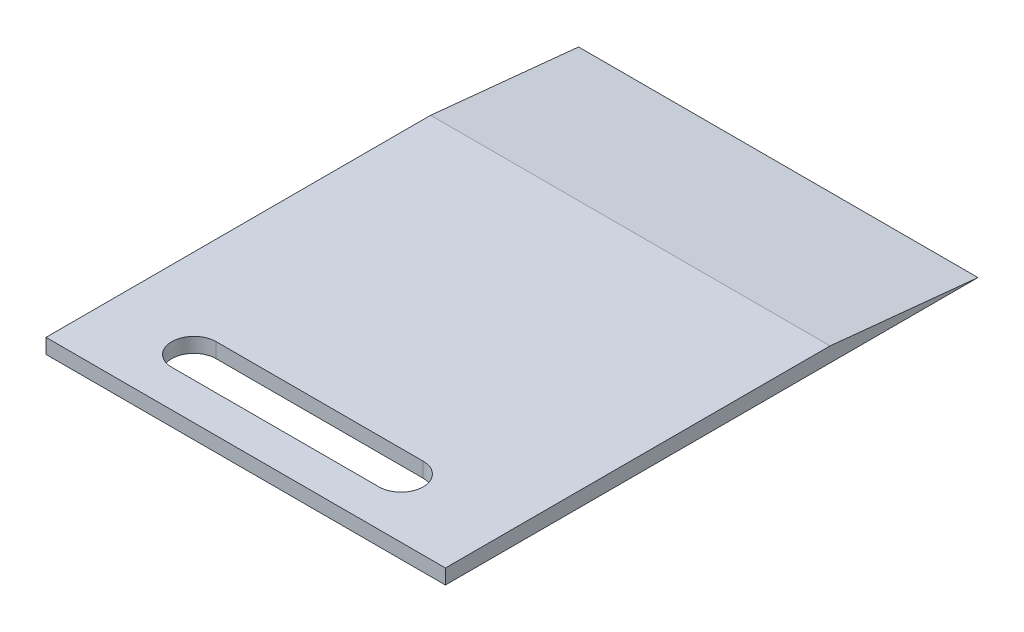
ISO-10303-21;
HEADER;
FILE_DESCRIPTION(('STEP AP214'),'2;1');
FILE_NAME('part.step','',(''),(''),'','','');
FILE_SCHEMA(('AUTOMOTIVE_DESIGN { 1 0 10303 214 1 1 1 1 }'));
ENDSEC;
DATA;
#1=APPLICATION_CONTEXT('core data for automotive mechanical design processes');
#2=APPLICATION_PROTOCOL_DEFINITION('international standard','automotive_design',2000,#1);
#3=PRODUCT_CONTEXT('',#1,'mechanical');
#4=PRODUCT('Part','Part','',(#3));
#5=PRODUCT_RELATED_PRODUCT_CATEGORY('part','',(#4));
#6=PRODUCT_DEFINITION_FORMATION('','',#4);
#7=PRODUCT_DEFINITION_CONTEXT('part definition',#1,'design');
#8=PRODUCT_DEFINITION('design','',#6,#7);
#9=PRODUCT_DEFINITION_SHAPE('','',#8);
#10=(LENGTH_UNIT() NAMED_UNIT(*) SI_UNIT(.MILLI.,.METRE.));
#11=(NAMED_UNIT(*) PLANE_ANGLE_UNIT() SI_UNIT($,.RADIAN.));
#12=(NAMED_UNIT(*) SI_UNIT($,.STERADIAN.) SOLID_ANGLE_UNIT());
#13=UNCERTAINTY_MEASURE_WITH_UNIT(LENGTH_MEASURE(1.E-05),#10,'distance_accuracy_value','');
#14=(GEOMETRIC_REPRESENTATION_CONTEXT(3) GLOBAL_UNCERTAINTY_ASSIGNED_CONTEXT((#13)) GLOBAL_UNIT_ASSIGNED_CONTEXT((#10,
#11,#12)) REPRESENTATION_CONTEXT('',''));
#15=CARTESIAN_POINT('',(0.,0.,0.));
#16=DIRECTION('',(0.,0.,1.));
#17=DIRECTION('',(1.,0.,0.));
#18=AXIS2_PLACEMENT_3D('',#15,#16,#17);
#19=CARTESIAN_POINT('',(13.5,0.5,0.));
#20=DIRECTION('',(0.,0.,-1.));
#21=DIRECTION('',(0.,1.,0.));
#22=AXIS2_PLACEMENT_3D('',#19,#20,#21);
#23=PLANE('',#22);
#24=DIRECTION('',(0.,-1.,0.));
#25=VECTOR('',#24,1.);
#26=CARTESIAN_POINT('',(0.,0.5,0.));
#27=LINE('',#26,#25);
#28=CARTESIAN_POINT('',(0.,0.5,0.));
#29=VERTEX_POINT('',#28);
#30=CARTESIAN_POINT('',(0.,0.,0.));
#31=VERTEX_POINT('',#30);
#32=EDGE_CURVE('E147',#29,#31,#27,.T.);
#33=ORIENTED_EDGE('',*,*,#32,.T.);
#34=DIRECTION('',(-1.,0.,0.));
#35=VECTOR('',#34,1.);
#36=CARTESIAN_POINT('',(13.5,0.,0.));
#37=LINE('',#36,#35);
#38=CARTESIAN_POINT('',(13.5,0.,0.));
#39=VERTEX_POINT('',#38);
#40=EDGE_CURVE('E11',#39,#31,#37,.T.);
#41=ORIENTED_EDGE('',*,*,#40,.F.);
#42=DIRECTION('',(0.,-1.,0.));
#43=VECTOR('',#42,1.);
#44=CARTESIAN_POINT('',(13.5,0.5,0.));
#45=LINE('',#44,#43);
#46=CARTESIAN_POINT('',(13.5,0.5,0.));
#47=VERTEX_POINT('',#46);
#48=EDGE_CURVE('E153',#47,#39,#45,.T.);
#49=ORIENTED_EDGE('',*,*,#48,.F.);
#50=DIRECTION('',(-1.,0.,0.));
#51=VECTOR('',#50,1.);
#52=CARTESIAN_POINT('',(13.5,0.5,0.));
#53=LINE('',#52,#51);
#54=EDGE_CURVE('E167',#47,#29,#53,.T.);
#55=ORIENTED_EDGE('',*,*,#54,.T.);
#56=EDGE_LOOP('',(#33,#41,#49,#55));
#57=FACE_BOUND('',#56,.T.);
#58=ADVANCED_FACE('F39',(#57),#23,.F.);
#59=CARTESIAN_POINT('',(13.5,0.,0.));
#60=DIRECTION('',(0.,1.,0.));
#61=DIRECTION('',(0.,0.,1.));
#62=AXIS2_PLACEMENT_3D('',#59,#60,#61);
#63=PLANE('',#62);
#64=DIRECTION('',(1.,0.,0.));
#65=VECTOR('',#64,1.);
#66=CARTESIAN_POINT('',(3.,0.,-2.75));
#67=LINE('',#66,#65);
#68=CARTESIAN_POINT('',(3.,0.,-2.75));
#69=VERTEX_POINT('',#68);
#70=CARTESIAN_POINT('',(10.,0.,-2.75));
#71=VERTEX_POINT('',#70);
#72=EDGE_CURVE('E114',#69,#71,#67,.T.);
#73=ORIENTED_EDGE('',*,*,#72,.F.);
#74=CARTESIAN_POINT('',(3.,0.,-2.));
#75=DIRECTION('',(0.,1.,0.));
#76=DIRECTION('',(0.,0.,1.));
#77=AXIS2_PLACEMENT_3D('',#74,#75,#76);
#78=CIRCLE('',#77,0.75);
#79=CARTESIAN_POINT('',(3.,0.,-1.25));
#80=VERTEX_POINT('',#79);
#81=EDGE_CURVE('E107',#69,#80,#78,.T.);
#82=ORIENTED_EDGE('',*,*,#81,.T.);
#83=DIRECTION('',(1.,0.,0.));
#84=VECTOR('',#83,1.);
#85=CARTESIAN_POINT('',(3.,0.,-1.25));
#86=LINE('',#85,#84);
#87=CARTESIAN_POINT('',(10.,0.,-1.25));
#88=VERTEX_POINT('',#87);
#89=EDGE_CURVE('E117',#80,#88,#86,.T.);
#90=ORIENTED_EDGE('',*,*,#89,.T.);
#91=CARTESIAN_POINT('',(10.,0.,-2.));
#92=DIRECTION('',(0.,1.,0.));
#93=DIRECTION('',(0.,0.,1.));
#94=AXIS2_PLACEMENT_3D('',#91,#92,#93);
#95=CIRCLE('',#94,0.75);
#96=EDGE_CURVE('E54',#88,#71,#95,.T.);
#97=ORIENTED_EDGE('',*,*,#96,.T.);
#98=EDGE_LOOP('',(#73,#82,#90,#97));
#99=FACE_BOUND('',#98,.T.);
#100=DIRECTION('',(0.,0.,-1.));
#101=VECTOR('',#100,1.);
#102=CARTESIAN_POINT('',(0.,0.,0.));
#103=LINE('',#102,#101);
#104=CARTESIAN_POINT('',(0.,0.,-18.));
#105=VERTEX_POINT('',#104);
#106=EDGE_CURVE('E171',#31,#105,#103,.T.);
#107=ORIENTED_EDGE('',*,*,#106,.T.);
#108=DIRECTION('',(-1.,0.,0.));
#109=VECTOR('',#108,1.);
#110=CARTESIAN_POINT('',(13.5,0.,-18.));
#111=LINE('',#110,#109);
#112=CARTESIAN_POINT('',(13.5,0.,-18.));
#113=VERTEX_POINT('',#112);
#114=EDGE_CURVE('E47',#113,#105,#111,.T.);
#115=ORIENTED_EDGE('',*,*,#114,.F.);
#116=DIRECTION('',(0.,0.,-1.));
#117=VECTOR('',#116,1.);
#118=CARTESIAN_POINT('',(13.5,0.,0.));
#119=LINE('',#118,#117);
#120=EDGE_CURVE('E157',#39,#113,#119,.T.);
#121=ORIENTED_EDGE('',*,*,#120,.F.);
#122=ORIENTED_EDGE('',*,*,#40,.T.);
#123=EDGE_LOOP('',(#107,#115,#121,#122));
#124=FACE_BOUND('',#123,.T.);
#125=ADVANCED_FACE('F122',(#99,#124),#63,.F.);
#126=CARTESIAN_POINT('',(13.5,0.,-18.));
#127=DIRECTION('',(0.,-0.995037190209989,0.0995037190209992));
#128=DIRECTION('',(0.,-0.0995037190209992,-0.995037190209989));
#129=AXIS2_PLACEMENT_3D('',#126,#127,#128);
#130=PLANE('',#129);
#131=DIRECTION('',(0.,0.0995037190209992,0.995037190209989));
#132=VECTOR('',#131,1.);
#133=CARTESIAN_POINT('',(0.,0.,-18.));
#134=LINE('',#133,#132);
#135=CARTESIAN_POINT('',(0.,0.500000000000001,-13.));
#136=VERTEX_POINT('',#135);
#137=EDGE_CURVE('E174',#105,#136,#134,.T.);
#138=ORIENTED_EDGE('',*,*,#137,.T.);
#139=DIRECTION('',(-1.,0.,0.));
#140=VECTOR('',#139,1.);
#141=CARTESIAN_POINT('',(13.5,0.500000000000001,-13.));
#142=LINE('',#141,#140);
#143=CARTESIAN_POINT('',(13.5,0.500000000000001,-13.));
#144=VERTEX_POINT('',#143);
#145=EDGE_CURVE('E182',#144,#136,#142,.T.);
#146=ORIENTED_EDGE('',*,*,#145,.F.);
#147=DIRECTION('',(0.,0.0995037190209992,0.995037190209989));
#148=VECTOR('',#147,1.);
#149=CARTESIAN_POINT('',(13.5,0.,-18.));
#150=LINE('',#149,#148);
#151=EDGE_CURVE('E161',#113,#144,#150,.T.);
#152=ORIENTED_EDGE('',*,*,#151,.F.);
#153=ORIENTED_EDGE('',*,*,#114,.T.);
#154=EDGE_LOOP('',(#138,#146,#152,#153));
#155=FACE_BOUND('',#154,.T.);
#156=ADVANCED_FACE('F191',(#155),#130,.F.);
#157=CARTESIAN_POINT('',(13.5,0.500000000000001,-13.));
#158=DIRECTION('',(0.,-1.,0.));
#159=DIRECTION('',(0.,0.,-1.));
#160=AXIS2_PLACEMENT_3D('',#157,#158,#159);
#161=PLANE('',#160);
#162=DIRECTION('',(1.,0.,0.));
#163=VECTOR('',#162,1.);
#164=CARTESIAN_POINT('',(3.,0.5,-1.25));
#165=LINE('',#164,#163);
#166=CARTESIAN_POINT('',(3.,0.5,-1.25));
#167=VERTEX_POINT('',#166);
#168=CARTESIAN_POINT('',(10.,0.5,-1.25));
#169=VERTEX_POINT('',#168);
#170=EDGE_CURVE('E138',#167,#169,#165,.T.);
#171=ORIENTED_EDGE('',*,*,#170,.F.);
#172=CARTESIAN_POINT('',(3.,0.5,-2.));
#173=DIRECTION('',(0.,1.,0.));
#174=DIRECTION('',(0.,0.,1.));
#175=AXIS2_PLACEMENT_3D('',#172,#173,#174);
#176=CIRCLE('',#175,0.75);
#177=CARTESIAN_POINT('',(3.,0.5,-2.75));
#178=VERTEX_POINT('',#177);
#179=EDGE_CURVE('E62',#178,#167,#176,.T.);
#180=ORIENTED_EDGE('',*,*,#179,.F.);
#181=DIRECTION('',(1.,0.,0.));
#182=VECTOR('',#181,1.);
#183=CARTESIAN_POINT('',(3.,0.5,-2.75));
#184=LINE('',#183,#182);
#185=CARTESIAN_POINT('',(10.,0.5,-2.75));
#186=VERTEX_POINT('',#185);
#187=EDGE_CURVE('E125',#178,#186,#184,.T.);
#188=ORIENTED_EDGE('',*,*,#187,.T.);
#189=CARTESIAN_POINT('',(10.,0.5,-2.));
#190=DIRECTION('',(0.,1.,0.));
#191=DIRECTION('',(0.,0.,1.));
#192=AXIS2_PLACEMENT_3D('',#189,#190,#191);
#193=CIRCLE('',#192,0.75);
#194=EDGE_CURVE('E129',#169,#186,#193,.T.);
#195=ORIENTED_EDGE('',*,*,#194,.F.);
#196=EDGE_LOOP('',(#171,#180,#188,#195));
#197=FACE_BOUND('',#196,.T.);
#198=DIRECTION('',(0.,0.,1.));
#199=VECTOR('',#198,1.);
#200=CARTESIAN_POINT('',(0.,0.500000000000001,-13.));
#201=LINE('',#200,#199);
#202=EDGE_CURVE('E158',#136,#29,#201,.T.);
#203=ORIENTED_EDGE('',*,*,#202,.T.);
#204=ORIENTED_EDGE('',*,*,#54,.F.);
#205=DIRECTION('',(0.,0.,1.));
#206=VECTOR('',#205,1.);
#207=CARTESIAN_POINT('',(13.5,0.500000000000001,-13.));
#208=LINE('',#207,#206);
#209=EDGE_CURVE('E164',#144,#47,#208,.T.);
#210=ORIENTED_EDGE('',*,*,#209,.F.);
#211=ORIENTED_EDGE('',*,*,#145,.T.);
#212=EDGE_LOOP('',(#203,#204,#210,#211));
#213=FACE_BOUND('',#212,.T.);
#214=ADVANCED_FACE('F199',(#197,#213),#161,.F.);
#215=CARTESIAN_POINT('',(13.5,0.,0.));
#216=DIRECTION('',(1.,0.,0.));
#217=DIRECTION('',(0.,0.,-1.));
#218=AXIS2_PLACEMENT_3D('',#215,#216,#217);
#219=PLANE('',#218);
#220=ORIENTED_EDGE('',*,*,#48,.T.);
#221=ORIENTED_EDGE('',*,*,#120,.T.);
#222=ORIENTED_EDGE('',*,*,#151,.T.);
#223=ORIENTED_EDGE('',*,*,#209,.T.);
#224=EDGE_LOOP('',(#220,#221,#222,#223));
#225=FACE_BOUND('',#224,.T.);
#226=ADVANCED_FACE('F205',(#225),#219,.T.);
#227=CARTESIAN_POINT('',(0.,0.,0.));
#228=DIRECTION('',(1.,0.,0.));
#229=DIRECTION('',(0.,0.,-1.));
#230=AXIS2_PLACEMENT_3D('',#227,#228,#229);
#231=PLANE('',#230);
#232=ORIENTED_EDGE('',*,*,#32,.F.);
#233=ORIENTED_EDGE('',*,*,#202,.F.);
#234=ORIENTED_EDGE('',*,*,#137,.F.);
#235=ORIENTED_EDGE('',*,*,#106,.F.);
#236=EDGE_LOOP('',(#232,#233,#234,#235));
#237=FACE_BOUND('',#236,.T.);
#238=ADVANCED_FACE('F196',(#237),#231,.F.);
#239=CARTESIAN_POINT('',(3.,0.,-2.));
#240=DIRECTION('',(0.,1.,0.));
#241=DIRECTION('',(0.,0.,1.));
#242=AXIS2_PLACEMENT_3D('',#239,#240,#241);
#243=CYLINDRICAL_SURFACE('',#242,0.75);
#244=ORIENTED_EDGE('',*,*,#179,.T.);
#245=DIRECTION('',(0.,1.,0.));
#246=VECTOR('',#245,1.);
#247=CARTESIAN_POINT('',(3.,0.,-1.25));
#248=LINE('',#247,#246);
#249=EDGE_CURVE('E103',#80,#167,#248,.T.);
#250=ORIENTED_EDGE('',*,*,#249,.F.);
#251=ORIENTED_EDGE('',*,*,#81,.F.);
#252=DIRECTION('',(0.,1.,0.));
#253=VECTOR('',#252,1.);
#254=CARTESIAN_POINT('',(3.,0.,-2.75));
#255=LINE('',#254,#253);
#256=EDGE_CURVE('E144',#69,#178,#255,.T.);
#257=ORIENTED_EDGE('',*,*,#256,.T.);
#258=EDGE_LOOP('',(#244,#250,#251,#257));
#259=FACE_BOUND('',#258,.T.);
#260=ADVANCED_FACE('F105',(#259),#243,.F.);
#261=CARTESIAN_POINT('',(3.,0.,-2.75));
#262=DIRECTION('',(0.,0.,1.));
#263=DIRECTION('',(0.,-1.,0.));
#264=AXIS2_PLACEMENT_3D('',#261,#262,#263);
#265=PLANE('',#264);
#266=ORIENTED_EDGE('',*,*,#187,.F.);
#267=ORIENTED_EDGE('',*,*,#256,.F.);
#268=ORIENTED_EDGE('',*,*,#72,.T.);
#269=DIRECTION('',(0.,1.,0.));
#270=VECTOR('',#269,1.);
#271=CARTESIAN_POINT('',(10.,0.,-2.75));
#272=LINE('',#271,#270);
#273=EDGE_CURVE('E148',#71,#186,#272,.T.);
#274=ORIENTED_EDGE('',*,*,#273,.T.);
#275=EDGE_LOOP('',(#266,#267,#268,#274));
#276=FACE_BOUND('',#275,.T.);
#277=ADVANCED_FACE('F222',(#276),#265,.T.);
#278=CARTESIAN_POINT('',(10.,0.,-2.));
#279=DIRECTION('',(0.,1.,0.));
#280=DIRECTION('',(0.,0.,1.));
#281=AXIS2_PLACEMENT_3D('',#278,#279,#280);
#282=CYLINDRICAL_SURFACE('',#281,0.75);
#283=ORIENTED_EDGE('',*,*,#194,.T.);
#284=ORIENTED_EDGE('',*,*,#273,.F.);
#285=ORIENTED_EDGE('',*,*,#96,.F.);
#286=DIRECTION('',(0.,1.,0.));
#287=VECTOR('',#286,1.);
#288=CARTESIAN_POINT('',(10.,0.,-1.25));
#289=LINE('',#288,#287);
#290=EDGE_CURVE('E113',#88,#169,#289,.T.);
#291=ORIENTED_EDGE('',*,*,#290,.T.);
#292=EDGE_LOOP('',(#283,#284,#285,#291));
#293=FACE_BOUND('',#292,.T.);
#294=ADVANCED_FACE('F225',(#293),#282,.F.);
#295=CARTESIAN_POINT('',(3.,0.,-1.25));
#296=DIRECTION('',(0.,0.,1.));
#297=DIRECTION('',(0.,-1.,0.));
#298=AXIS2_PLACEMENT_3D('',#295,#296,#297);
#299=PLANE('',#298);
#300=ORIENTED_EDGE('',*,*,#170,.T.);
#301=ORIENTED_EDGE('',*,*,#290,.F.);
#302=ORIENTED_EDGE('',*,*,#89,.F.);
#303=ORIENTED_EDGE('',*,*,#249,.T.);
#304=EDGE_LOOP('',(#300,#301,#302,#303));
#305=FACE_BOUND('',#304,.T.);
#306=ADVANCED_FACE('F118',(#305),#299,.F.);
#307=CLOSED_SHELL('',(#58,#125,#156,#214,#226,#238,#260,#277,#294,#306));
#308=MANIFOLD_SOLID_BREP('B2',#307);
#309=ADVANCED_BREP_SHAPE_REPRESENTATION('',(#18,#308),#14);
#310=SHAPE_DEFINITION_REPRESENTATION(#9,#309);
ENDSEC;
END-ISO-10303-21;
